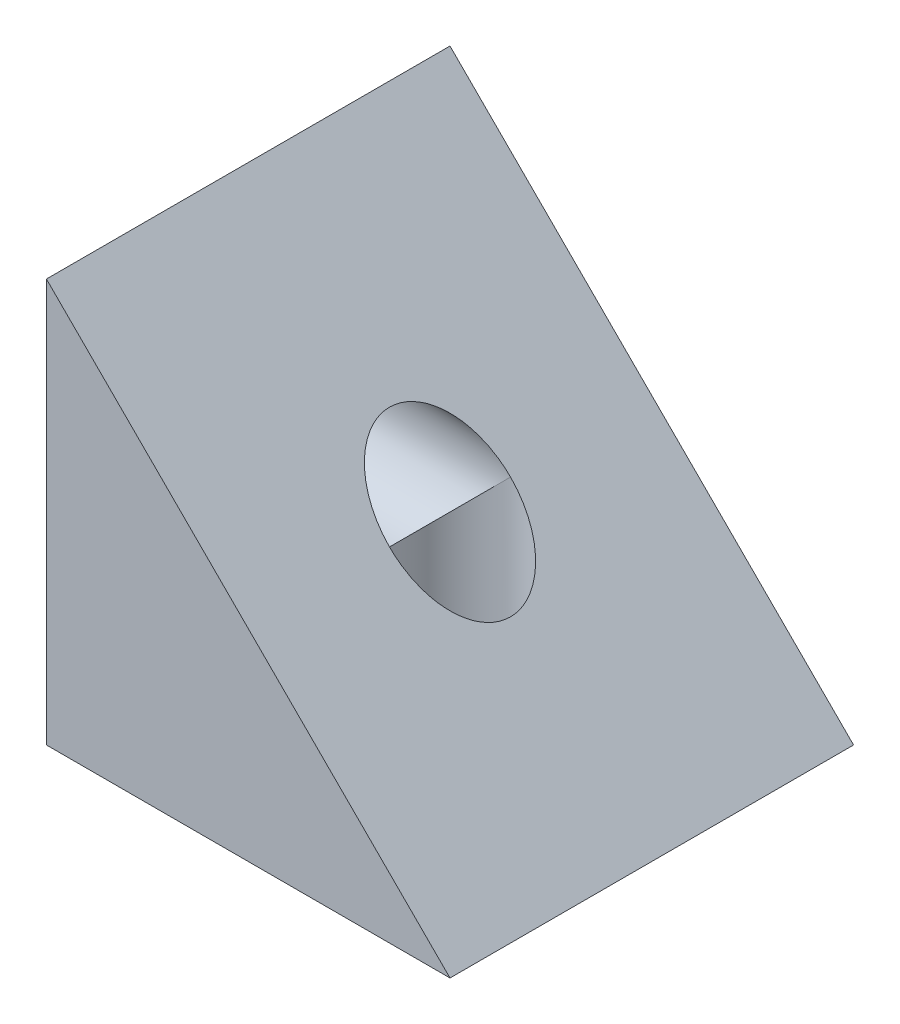
ISO-10303-21;
HEADER;
FILE_DESCRIPTION(('STEP AP214'),'2;1');
FILE_NAME('part.step','',(''),(''),'','','');
FILE_SCHEMA(('AUTOMOTIVE_DESIGN { 1 0 10303 214 1 1 1 1 }'));
ENDSEC;
DATA;
#1=APPLICATION_CONTEXT('core data for automotive mechanical design processes');
#2=APPLICATION_PROTOCOL_DEFINITION('international standard','automotive_design',2000,#1);
#3=PRODUCT_CONTEXT('',#1,'mechanical');
#4=PRODUCT('Part','Part','',(#3));
#5=PRODUCT_RELATED_PRODUCT_CATEGORY('part','',(#4));
#6=PRODUCT_DEFINITION_FORMATION('','',#4);
#7=PRODUCT_DEFINITION_CONTEXT('part definition',#1,'design');
#8=PRODUCT_DEFINITION('design','',#6,#7);
#9=PRODUCT_DEFINITION_SHAPE('','',#8);
#10=(LENGTH_UNIT() NAMED_UNIT(*) SI_UNIT(.MILLI.,.METRE.));
#11=(NAMED_UNIT(*) PLANE_ANGLE_UNIT() SI_UNIT($,.RADIAN.));
#12=(NAMED_UNIT(*) SI_UNIT($,.STERADIAN.) SOLID_ANGLE_UNIT());
#13=UNCERTAINTY_MEASURE_WITH_UNIT(LENGTH_MEASURE(1.E-05),#10,'distance_accuracy_value','');
#14=(GEOMETRIC_REPRESENTATION_CONTEXT(3) GLOBAL_UNCERTAINTY_ASSIGNED_CONTEXT((#13)) GLOBAL_UNIT_ASSIGNED_CONTEXT((#10,
#11,#12)) REPRESENTATION_CONTEXT('',''));
#15=CARTESIAN_POINT('',(0.,0.,0.));
#16=DIRECTION('',(0.,0.,1.));
#17=DIRECTION('',(1.,0.,0.));
#18=AXIS2_PLACEMENT_3D('',#15,#16,#17);
#19=CARTESIAN_POINT('',(5.,-5.,5.));
#20=DIRECTION('',(-0.707106781186548,-0.707106781186548,0.));
#21=DIRECTION('',(0.707106781186548,-0.707106781186548,0.));
#22=AXIS2_PLACEMENT_3D('',#19,#20,#21);
#23=PLANE('',#22);
#24=CARTESIAN_POINT('',(0.,0.,0.));
#25=DIRECTION('',(-0.707106781186548,-0.707106781186548,0.));
#26=DIRECTION('',(-0.707106781186548,0.707106781186548,0.));
#27=AXIS2_PLACEMENT_3D('',#24,#25,#26);
#28=ELLIPSE('',#27,2.12132034355964,1.5);
#29=CARTESIAN_POINT('',(0.,0.,-1.5));
#30=VERTEX_POINT('',#29);
#31=CARTESIAN_POINT('',(0.,0.,1.5));
#32=VERTEX_POINT('',#31);
#33=EDGE_CURVE('E46',#30,#32,#28,.T.);
#34=ORIENTED_EDGE('',*,*,#33,.T.);
#35=EDGE_CURVE('E84',#32,#30,#28,.T.);
#36=ORIENTED_EDGE('',*,*,#35,.T.);
#37=EDGE_LOOP('',(#34,#36));
#38=FACE_BOUND('',#37,.T.);
#39=DIRECTION('',(-0.707106781186548,0.707106781186548,0.));
#40=VECTOR('',#39,1.);
#41=CARTESIAN_POINT('',(5.,-5.,-5.));
#42=LINE('',#41,#40);
#43=CARTESIAN_POINT('',(5.,-5.,-5.));
#44=VERTEX_POINT('',#43);
#45=CARTESIAN_POINT('',(-5.,5.,-5.));
#46=VERTEX_POINT('',#45);
#47=EDGE_CURVE('E90',#44,#46,#42,.T.);
#48=ORIENTED_EDGE('',*,*,#47,.T.);
#49=DIRECTION('',(0.,0.,-1.));
#50=VECTOR('',#49,1.);
#51=CARTESIAN_POINT('',(-5.,5.,5.));
#52=LINE('',#51,#50);
#53=CARTESIAN_POINT('',(-5.,5.,5.));
#54=VERTEX_POINT('',#53);
#55=EDGE_CURVE('E40',#54,#46,#52,.T.);
#56=ORIENTED_EDGE('',*,*,#55,.F.);
#57=DIRECTION('',(-0.707106781186548,0.707106781186548,0.));
#58=VECTOR('',#57,1.);
#59=CARTESIAN_POINT('',(5.,-5.,5.));
#60=LINE('',#59,#58);
#61=CARTESIAN_POINT('',(5.,-5.,5.));
#62=VERTEX_POINT('',#61);
#63=EDGE_CURVE('E97',#62,#54,#60,.T.);
#64=ORIENTED_EDGE('',*,*,#63,.F.);
#65=DIRECTION('',(0.,0.,-1.));
#66=VECTOR('',#65,1.);
#67=CARTESIAN_POINT('',(5.,-5.,5.));
#68=LINE('',#67,#66);
#69=EDGE_CURVE('E100',#62,#44,#68,.T.);
#70=ORIENTED_EDGE('',*,*,#69,.T.);
#71=EDGE_LOOP('',(#48,#56,#64,#70));
#72=FACE_BOUND('',#71,.T.);
#73=ADVANCED_FACE('F33',(#38,#72),#23,.F.);
#74=CARTESIAN_POINT('',(-5.,5.,5.));
#75=DIRECTION('',(1.,0.,0.));
#76=DIRECTION('',(0.,1.,0.));
#77=AXIS2_PLACEMENT_3D('',#74,#75,#76);
#78=PLANE('',#77);
#79=CARTESIAN_POINT('',(-5.,0.,0.));
#80=DIRECTION('',(1.,0.,0.));
#81=DIRECTION('',(0.,1.,0.));
#82=AXIS2_PLACEMENT_3D('',#79,#80,#81);
#83=CIRCLE('',#82,1.5);
#84=CARTESIAN_POINT('',(-5.,1.5,0.));
#85=VERTEX_POINT('',#84);
#86=EDGE_CURVE('E87',#85,#85,#83,.T.);
#87=ORIENTED_EDGE('',*,*,#86,.T.);
#88=EDGE_LOOP('',(#87));
#89=FACE_BOUND('',#88,.T.);
#90=DIRECTION('',(0.,-1.,0.));
#91=VECTOR('',#90,1.);
#92=CARTESIAN_POINT('',(-5.,5.,-5.));
#93=LINE('',#92,#91);
#94=CARTESIAN_POINT('',(-5.,-5.,-5.));
#95=VERTEX_POINT('',#94);
#96=EDGE_CURVE('E92',#46,#95,#93,.T.);
#97=ORIENTED_EDGE('',*,*,#96,.T.);
#98=DIRECTION('',(0.,0.,-1.));
#99=VECTOR('',#98,1.);
#100=CARTESIAN_POINT('',(-5.,-5.,5.));
#101=LINE('',#100,#99);
#102=CARTESIAN_POINT('',(-5.,-5.,5.));
#103=VERTEX_POINT('',#102);
#104=EDGE_CURVE('E105',#103,#95,#101,.T.);
#105=ORIENTED_EDGE('',*,*,#104,.F.);
#106=DIRECTION('',(0.,-1.,0.));
#107=VECTOR('',#106,1.);
#108=CARTESIAN_POINT('',(-5.,5.,5.));
#109=LINE('',#108,#107);
#110=EDGE_CURVE('E77',#54,#103,#109,.T.);
#111=ORIENTED_EDGE('',*,*,#110,.F.);
#112=ORIENTED_EDGE('',*,*,#55,.T.);
#113=EDGE_LOOP('',(#97,#105,#111,#112));
#114=FACE_BOUND('',#113,.T.);
#115=ADVANCED_FACE('F123',(#89,#114),#78,.F.);
#116=CARTESIAN_POINT('',(-5.,-5.,5.));
#117=DIRECTION('',(0.,1.,0.));
#118=DIRECTION('',(0.,0.,1.));
#119=AXIS2_PLACEMENT_3D('',#116,#117,#118);
#120=PLANE('',#119);
#121=CARTESIAN_POINT('',(0.,-5.,0.));
#122=DIRECTION('',(0.,1.,0.));
#123=DIRECTION('',(0.,0.,1.));
#124=AXIS2_PLACEMENT_3D('',#121,#122,#123);
#125=CIRCLE('',#124,1.5);
#126=CARTESIAN_POINT('',(0.,-5.,1.5));
#127=VERTEX_POINT('',#126);
#128=EDGE_CURVE('E96',#127,#127,#125,.T.);
#129=ORIENTED_EDGE('',*,*,#128,.T.);
#130=EDGE_LOOP('',(#129));
#131=FACE_BOUND('',#130,.T.);
#132=DIRECTION('',(1.,0.,0.));
#133=VECTOR('',#132,1.);
#134=CARTESIAN_POINT('',(-5.,-5.,-5.));
#135=LINE('',#134,#133);
#136=EDGE_CURVE('E71',#95,#44,#135,.T.);
#137=ORIENTED_EDGE('',*,*,#136,.T.);
#138=ORIENTED_EDGE('',*,*,#69,.F.);
#139=DIRECTION('',(1.,0.,0.));
#140=VECTOR('',#139,1.);
#141=CARTESIAN_POINT('',(-5.,-5.,5.));
#142=LINE('',#141,#140);
#143=EDGE_CURVE('E54',#103,#62,#142,.T.);
#144=ORIENTED_EDGE('',*,*,#143,.F.);
#145=ORIENTED_EDGE('',*,*,#104,.T.);
#146=EDGE_LOOP('',(#137,#138,#144,#145));
#147=FACE_BOUND('',#146,.T.);
#148=ADVANCED_FACE('F113',(#131,#147),#120,.F.);
#149=CARTESIAN_POINT('',(0.,0.,5.));
#150=DIRECTION('',(0.,0.,1.));
#151=DIRECTION('',(1.,0.,0.));
#152=AXIS2_PLACEMENT_3D('',#149,#150,#151);
#153=PLANE('',#152);
#154=ORIENTED_EDGE('',*,*,#63,.T.);
#155=ORIENTED_EDGE('',*,*,#110,.T.);
#156=ORIENTED_EDGE('',*,*,#143,.T.);
#157=EDGE_LOOP('',(#154,#155,#156));
#158=FACE_BOUND('',#157,.T.);
#159=ADVANCED_FACE('F130',(#158),#153,.T.);
#160=CARTESIAN_POINT('',(0.,0.,-5.));
#161=DIRECTION('',(0.,0.,1.));
#162=DIRECTION('',(1.,0.,0.));
#163=AXIS2_PLACEMENT_3D('',#160,#161,#162);
#164=PLANE('',#163);
#165=ORIENTED_EDGE('',*,*,#47,.F.);
#166=ORIENTED_EDGE('',*,*,#136,.F.);
#167=ORIENTED_EDGE('',*,*,#96,.F.);
#168=EDGE_LOOP('',(#165,#166,#167));
#169=FACE_BOUND('',#168,.T.);
#170=ADVANCED_FACE('F119',(#169),#164,.F.);
#171=CARTESIAN_POINT('',(5.,0.,0.));
#172=DIRECTION('',(-1.,0.,0.));
#173=DIRECTION('',(0.,-1.,0.));
#174=AXIS2_PLACEMENT_3D('',#171,#172,#173);
#175=CYLINDRICAL_SURFACE('',#174,1.5);
#176=ORIENTED_EDGE('',*,*,#86,.F.);
#177=EDGE_LOOP('',(#176));
#178=FACE_BOUND('',#177,.T.);
#179=ORIENTED_EDGE('',*,*,#35,.F.);
#180=CARTESIAN_POINT('',(0.,0.,0.));
#181=DIRECTION('',(-0.707106781186547,0.707106781186547,0.));
#182=DIRECTION('',(-0.707106781186547,-0.707106781186548,0.));
#183=AXIS2_PLACEMENT_3D('',#180,#181,#182);
#184=ELLIPSE('',#183,2.12132034355964,1.5);
#185=EDGE_CURVE('E11',#32,#30,#184,.F.);
#186=ORIENTED_EDGE('',*,*,#185,.T.);
#187=EDGE_LOOP('',(#179,#186));
#188=FACE_BOUND('',#187,.T.);
#189=ADVANCED_FACE('F85',(#178,#188),#175,.F.);
#190=CARTESIAN_POINT('',(0.,5.,0.));
#191=DIRECTION('',(0.,-1.,0.));
#192=DIRECTION('',(0.,0.,-1.));
#193=AXIS2_PLACEMENT_3D('',#190,#191,#192);
#194=CYLINDRICAL_SURFACE('',#193,1.5);
#195=ORIENTED_EDGE('',*,*,#185,.F.);
#196=ORIENTED_EDGE('',*,*,#33,.F.);
#197=EDGE_LOOP('',(#195,#196));
#198=FACE_BOUND('',#197,.T.);
#199=ORIENTED_EDGE('',*,*,#128,.F.);
#200=EDGE_LOOP('',(#199));
#201=FACE_BOUND('',#200,.T.);
#202=ADVANCED_FACE('F80',(#198,#201),#194,.F.);
#203=CLOSED_SHELL('',(#73,#115,#148,#159,#170,#189,#202));
#204=MANIFOLD_SOLID_BREP('B2',#203);
#205=ADVANCED_BREP_SHAPE_REPRESENTATION('',(#18,#204),#14);
#206=SHAPE_DEFINITION_REPRESENTATION(#9,#205);
ENDSEC;
END-ISO-10303-21;
